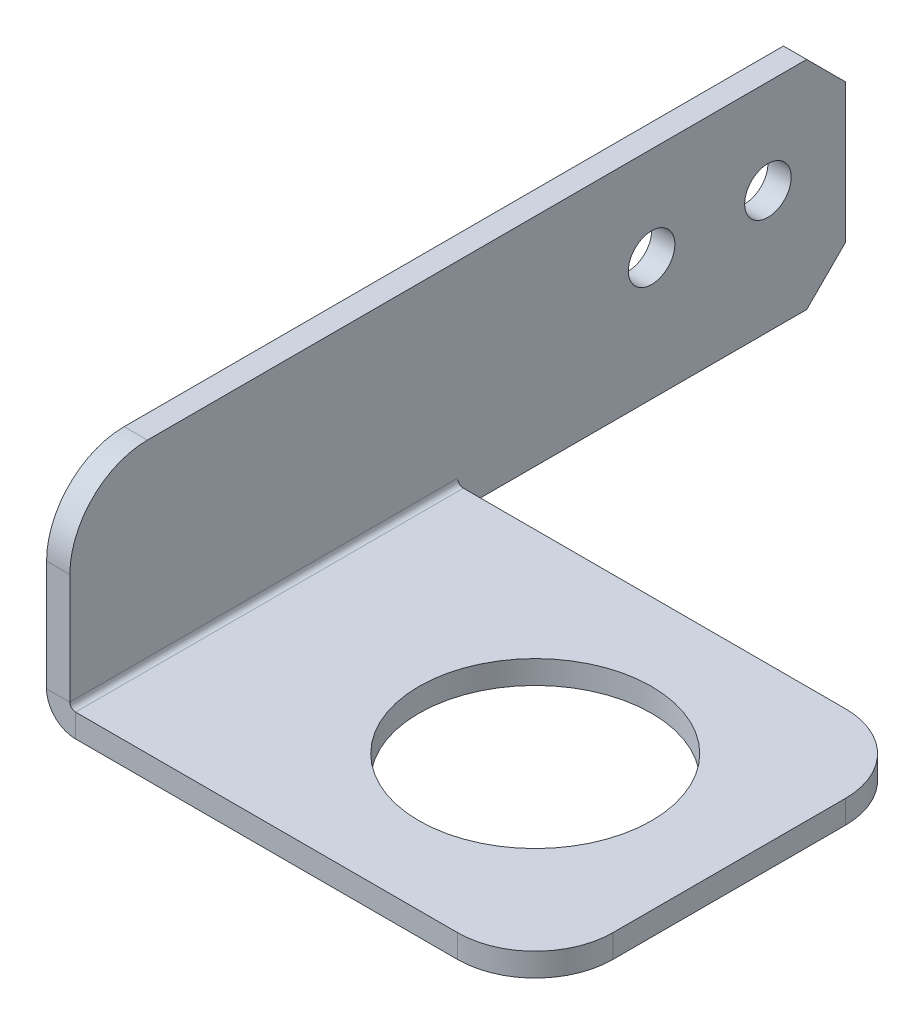
ISO-10303-21;
HEADER;
FILE_DESCRIPTION(('STEP AP214'),'2;1');
FILE_NAME('part.step','',(''),(''),'','','');
FILE_SCHEMA(('AUTOMOTIVE_DESIGN { 1 0 10303 214 1 1 1 1 }'));
ENDSEC;
DATA;
#1=APPLICATION_CONTEXT('core data for automotive mechanical design processes');
#2=APPLICATION_PROTOCOL_DEFINITION('international standard','automotive_design',2000,#1);
#3=PRODUCT_CONTEXT('',#1,'mechanical');
#4=PRODUCT('Part','Part','',(#3));
#5=PRODUCT_RELATED_PRODUCT_CATEGORY('part','',(#4));
#6=PRODUCT_DEFINITION_FORMATION('','',#4);
#7=PRODUCT_DEFINITION_CONTEXT('part definition',#1,'design');
#8=PRODUCT_DEFINITION('design','',#6,#7);
#9=PRODUCT_DEFINITION_SHAPE('','',#8);
#10=(LENGTH_UNIT() NAMED_UNIT(*) SI_UNIT(.MILLI.,.METRE.));
#11=(NAMED_UNIT(*) PLANE_ANGLE_UNIT() SI_UNIT($,.RADIAN.));
#12=(NAMED_UNIT(*) SI_UNIT($,.STERADIAN.) SOLID_ANGLE_UNIT());
#13=UNCERTAINTY_MEASURE_WITH_UNIT(LENGTH_MEASURE(1.E-05),#10,'distance_accuracy_value','');
#14=(GEOMETRIC_REPRESENTATION_CONTEXT(3) GLOBAL_UNCERTAINTY_ASSIGNED_CONTEXT((#13)) GLOBAL_UNIT_ASSIGNED_CONTEXT((#10,
#11,#12)) REPRESENTATION_CONTEXT('',''));
#15=CARTESIAN_POINT('',(0.,0.,0.));
#16=DIRECTION('',(0.,0.,1.));
#17=DIRECTION('',(1.,0.,0.));
#18=AXIS2_PLACEMENT_3D('',#15,#16,#17);
#19=CARTESIAN_POINT('',(0.7366,-3.,-100.));
#20=DIRECTION('',(0.,0.,-1.));
#21=DIRECTION('',(-1.,0.,0.));
#22=AXIS2_PLACEMENT_3D('',#19,#20,#21);
#23=PLANE('',#22);
#24=DIRECTION('',(1.,0.,0.));
#25=VECTOR('',#24,1.);
#26=CARTESIAN_POINT('',(-3.,2.07332277871303,-100.));
#27=LINE('',#26,#25);
#28=CARTESIAN_POINT('',(-3.,2.07332277871303,-100.));
#29=VERTEX_POINT('',#28);
#30=CARTESIAN_POINT('',(0.,2.07332277871303,-100.));
#31=VERTEX_POINT('',#30);
#32=EDGE_CURVE('E49',#29,#31,#27,.T.);
#33=ORIENTED_EDGE('',*,*,#32,.F.);
#34=DIRECTION('',(0.,-1.,0.));
#35=VECTOR('',#34,1.);
#36=CARTESIAN_POINT('',(-3.,25.,-100.));
#37=LINE('',#36,#35);
#38=CARTESIAN_POINT('',(-3.,20.,-100.));
#39=VERTEX_POINT('',#38);
#40=EDGE_CURVE('E145',#39,#29,#37,.T.);
#41=ORIENTED_EDGE('',*,*,#40,.F.);
#42=DIRECTION('',(1.,0.,0.));
#43=VECTOR('',#42,1.);
#44=CARTESIAN_POINT('',(-3.,20.,-100.));
#45=LINE('',#44,#43);
#46=CARTESIAN_POINT('',(0.,20.,-100.));
#47=VERTEX_POINT('',#46);
#48=EDGE_CURVE('E272',#39,#47,#45,.T.);
#49=ORIENTED_EDGE('',*,*,#48,.T.);
#50=DIRECTION('',(0.,-1.,0.));
#51=VECTOR('',#50,1.);
#52=CARTESIAN_POINT('',(0.,25.,-100.));
#53=LINE('',#52,#51);
#54=EDGE_CURVE('E147',#47,#31,#53,.T.);
#55=ORIENTED_EDGE('',*,*,#54,.T.);
#56=EDGE_LOOP('',(#33,#41,#49,#55));
#57=FACE_BOUND('',#56,.T.);
#58=ADVANCED_FACE('F34',(#57),#23,.T.);
#59=CARTESIAN_POINT('',(0.7366,0.,0.));
#60=DIRECTION('',(0.,0.,1.));
#61=DIRECTION('',(1.,0.,0.));
#62=AXIS2_PLACEMENT_3D('',#59,#60,#61);
#63=PLANE('',#62);
#64=DIRECTION('',(0.,-1.,0.));
#65=VECTOR('',#64,1.);
#66=CARTESIAN_POINT('',(0.7366,0.,0.));
#67=LINE('',#66,#65);
#68=CARTESIAN_POINT('',(0.7366,0.,0.));
#69=VERTEX_POINT('',#68);
#70=CARTESIAN_POINT('',(0.7366,-3.,0.));
#71=VERTEX_POINT('',#70);
#72=EDGE_CURVE('E198',#69,#71,#67,.T.);
#73=ORIENTED_EDGE('',*,*,#72,.F.);
#74=CARTESIAN_POINT('',(0.7366,0.7366,0.));
#75=DIRECTION('',(0.,0.,-1.));
#76=DIRECTION('',(-1.,0.,0.));
#77=AXIS2_PLACEMENT_3D('',#74,#75,#76);
#78=CIRCLE('',#77,0.7366);
#79=CARTESIAN_POINT('',(0.,0.7366,0.));
#80=VERTEX_POINT('',#79);
#81=EDGE_CURVE('E170',#80,#69,#78,.F.);
#82=ORIENTED_EDGE('',*,*,#81,.F.);
#83=DIRECTION('',(1.,0.,0.));
#84=VECTOR('',#83,1.);
#85=CARTESIAN_POINT('',(-3.,0.736600000000001,0.));
#86=LINE('',#85,#84);
#87=CARTESIAN_POINT('',(-3.,0.736600000000001,0.));
#88=VERTEX_POINT('',#87);
#89=EDGE_CURVE('E182',#88,#80,#86,.T.);
#90=ORIENTED_EDGE('',*,*,#89,.F.);
#91=CARTESIAN_POINT('',(0.7366,0.7366,0.));
#92=DIRECTION('',(0.,0.,1.));
#93=DIRECTION('',(1.,0.,0.));
#94=AXIS2_PLACEMENT_3D('',#91,#92,#93);
#95=CIRCLE('',#94,3.7366);
#96=EDGE_CURVE('E159',#88,#71,#95,.T.);
#97=ORIENTED_EDGE('',*,*,#96,.T.);
#98=EDGE_LOOP('',(#73,#82,#90,#97));
#99=FACE_BOUND('',#98,.T.);
#100=ADVANCED_FACE('F308',(#99),#63,.T.);
#101=CARTESIAN_POINT('',(-3.,0.736600000000001,0.));
#102=DIRECTION('',(0.,0.,1.));
#103=DIRECTION('',(1.,0.,0.));
#104=AXIS2_PLACEMENT_3D('',#101,#102,#103);
#105=PLANE('',#104);
#106=DIRECTION('',(1.,0.,0.));
#107=VECTOR('',#106,1.);
#108=CARTESIAN_POINT('',(0.,-3.,0.));
#109=LINE('',#108,#107);
#110=CARTESIAN_POINT('',(50.,-3.,0.));
#111=VERTEX_POINT('',#110);
#112=EDGE_CURVE('E163',#71,#111,#109,.T.);
#113=ORIENTED_EDGE('',*,*,#112,.T.);
#114=DIRECTION('',(0.,-1.,0.));
#115=VECTOR('',#114,1.);
#116=CARTESIAN_POINT('',(50.,0.,0.));
#117=LINE('',#116,#115);
#118=CARTESIAN_POINT('',(50.,0.,0.));
#119=VERTEX_POINT('',#118);
#120=EDGE_CURVE('E11',#111,#119,#117,.F.);
#121=ORIENTED_EDGE('',*,*,#120,.T.);
#122=DIRECTION('',(1.,0.,0.));
#123=VECTOR('',#122,1.);
#124=CARTESIAN_POINT('',(0.,0.,0.));
#125=LINE('',#124,#123);
#126=EDGE_CURVE('E166',#69,#119,#125,.T.);
#127=ORIENTED_EDGE('',*,*,#126,.F.);
#128=ORIENTED_EDGE('',*,*,#72,.T.);
#129=EDGE_LOOP('',(#113,#121,#127,#128));
#130=FACE_BOUND('',#129,.T.);
#131=ADVANCED_FACE('F313',(#130),#105,.T.);
#132=CARTESIAN_POINT('',(0.,-3.,-100.));
#133=DIRECTION('',(0.,-1.,0.));
#134=DIRECTION('',(0.,0.,-1.));
#135=AXIS2_PLACEMENT_3D('',#132,#133,#134);
#136=PLANE('',#135);
#137=CARTESIAN_POINT('',(35.,-3.,-25.));
#138=DIRECTION('',(0.,1.,0.));
#139=DIRECTION('',(0.,0.,1.));
#140=AXIS2_PLACEMENT_3D('',#137,#138,#139);
#141=CIRCLE('',#140,15.);
#142=CARTESIAN_POINT('',(35.,-3.,-10.));
#143=VERTEX_POINT('',#142);
#144=EDGE_CURVE('E288',#143,#143,#141,.T.);
#145=ORIENTED_EDGE('',*,*,#144,.T.);
#146=EDGE_LOOP('',(#145));
#147=FACE_BOUND('',#146,.T.);
#148=DIRECTION('',(1.,0.,0.));
#149=VECTOR('',#148,1.);
#150=CARTESIAN_POINT('',(0.,-3.,-50.));
#151=LINE('',#150,#149);
#152=CARTESIAN_POINT('',(0.7366,-3.,-50.));
#153=VERTEX_POINT('',#152);
#154=CARTESIAN_POINT('',(50.,-3.,-50.));
#155=VERTEX_POINT('',#154);
#156=EDGE_CURVE('E230',#153,#155,#151,.T.);
#157=ORIENTED_EDGE('',*,*,#156,.T.);
#158=CARTESIAN_POINT('',(50.,-3.,-40.));
#159=DIRECTION('',(0.,-1.,0.));
#160=DIRECTION('',(0.,0.,-1.));
#161=AXIS2_PLACEMENT_3D('',#158,#159,#160);
#162=CIRCLE('',#161,10.);
#163=CARTESIAN_POINT('',(60.,-3.,-40.));
#164=VERTEX_POINT('',#163);
#165=EDGE_CURVE('E42',#155,#164,#162,.T.);
#166=ORIENTED_EDGE('',*,*,#165,.T.);
#167=DIRECTION('',(0.,0.,1.));
#168=VECTOR('',#167,1.);
#169=CARTESIAN_POINT('',(60.,-3.,-100.));
#170=LINE('',#169,#168);
#171=CARTESIAN_POINT('',(60.,-3.,-9.99999999999999));
#172=VERTEX_POINT('',#171);
#173=EDGE_CURVE('E154',#164,#172,#170,.T.);
#174=ORIENTED_EDGE('',*,*,#173,.T.);
#175=CARTESIAN_POINT('',(50.,-3.,-9.99999999999999));
#176=DIRECTION('',(0.,-1.,0.));
#177=DIRECTION('',(0.,0.,-1.));
#178=AXIS2_PLACEMENT_3D('',#175,#176,#177);
#179=CIRCLE('',#178,10.);
#180=EDGE_CURVE('E223',#172,#111,#179,.T.);
#181=ORIENTED_EDGE('',*,*,#180,.T.);
#182=ORIENTED_EDGE('',*,*,#112,.F.);
#183=DIRECTION('',(0.,0.,1.));
#184=VECTOR('',#183,1.);
#185=CARTESIAN_POINT('',(0.7366,-3.,-100.));
#186=LINE('',#185,#184);
#187=EDGE_CURVE('E180',#153,#71,#186,.T.);
#188=ORIENTED_EDGE('',*,*,#187,.F.);
#189=EDGE_LOOP('',(#157,#166,#174,#181,#182,#188));
#190=FACE_BOUND('',#189,.T.);
#191=ADVANCED_FACE('F228',(#147,#190),#136,.T.);
#192=CARTESIAN_POINT('',(0.7366,0.7366,-100.));
#193=DIRECTION('',(0.,0.,1.));
#194=DIRECTION('',(1.,0.,0.));
#195=AXIS2_PLACEMENT_3D('',#192,#193,#194);
#196=CYLINDRICAL_SURFACE('',#195,3.7366);
#197=CARTESIAN_POINT('',(0.7366,0.7366,-98.663277221287));
#198=DIRECTION('',(0.,0.707106781186547,0.707106781186547));
#199=DIRECTION('',(0.,-0.707106781186548,0.707106781186548));
#200=AXIS2_PLACEMENT_3D('',#197,#198,#199);
#201=ELLIPSE('',#200,5.28435039716331,3.7366);
#202=CARTESIAN_POINT('',(0.,-2.92667722128697,-95.));
#203=VERTEX_POINT('',#202);
#204=CARTESIAN_POINT('',(-3.,0.736599999999998,-98.663277221287));
#205=VERTEX_POINT('',#204);
#206=EDGE_CURVE('E135',#203,#205,#201,.F.);
#207=ORIENTED_EDGE('',*,*,#206,.F.);
#208=DIRECTION('',(0.,0.,1.));
#209=VECTOR('',#208,1.);
#210=CARTESIAN_POINT('',(0.,-2.92667722128697,-100.));
#211=LINE('',#210,#209);
#212=CARTESIAN_POINT('',(0.,-2.92667722128697,-50.));
#213=VERTEX_POINT('',#212);
#214=EDGE_CURVE('E167',#213,#203,#211,.F.);
#215=ORIENTED_EDGE('',*,*,#214,.F.);
#216=CARTESIAN_POINT('',(0.7366,0.7366,-50.));
#217=DIRECTION('',(0.,0.,1.));
#218=DIRECTION('',(1.,0.,0.));
#219=AXIS2_PLACEMENT_3D('',#216,#217,#218);
#220=CIRCLE('',#219,3.7366);
#221=EDGE_CURVE('E251',#153,#213,#220,.F.);
#222=ORIENTED_EDGE('',*,*,#221,.F.);
#223=ORIENTED_EDGE('',*,*,#187,.T.);
#224=ORIENTED_EDGE('',*,*,#96,.F.);
#225=DIRECTION('',(0.,0.,1.));
#226=VECTOR('',#225,1.);
#227=CARTESIAN_POINT('',(-3.,0.736600000000001,-100.));
#228=LINE('',#227,#226);
#229=EDGE_CURVE('E183',#205,#88,#228,.T.);
#230=ORIENTED_EDGE('',*,*,#229,.F.);
#231=EDGE_LOOP('',(#207,#215,#222,#223,#224,#230));
#232=FACE_BOUND('',#231,.T.);
#233=ADVANCED_FACE('F264',(#232),#196,.T.);
#234=CARTESIAN_POINT('',(-3.,25.,-100.));
#235=DIRECTION('',(-1.,0.,0.));
#236=DIRECTION('',(0.,-1.,0.));
#237=AXIS2_PLACEMENT_3D('',#234,#235,#236);
#238=PLANE('',#237);
#239=DIRECTION('',(0.,-0.707106781186547,0.707106781186547));
#240=VECTOR('',#239,1.);
#241=CARTESIAN_POINT('',(-3.,-2.92667722128697,-95.));
#242=LINE('',#241,#240);
#243=EDGE_CURVE('E132',#29,#205,#242,.T.);
#244=ORIENTED_EDGE('',*,*,#243,.T.);
#245=ORIENTED_EDGE('',*,*,#229,.T.);
#246=DIRECTION('',(0.,-1.,0.));
#247=VECTOR('',#246,1.);
#248=CARTESIAN_POINT('',(-3.,25.,0.));
#249=LINE('',#248,#247);
#250=CARTESIAN_POINT('',(-3.,15.,0.));
#251=VERTEX_POINT('',#250);
#252=EDGE_CURVE('E175',#251,#88,#249,.T.);
#253=ORIENTED_EDGE('',*,*,#252,.F.);
#254=CARTESIAN_POINT('',(-3.,15.,-9.99999999999999));
#255=DIRECTION('',(-1.,0.,0.));
#256=DIRECTION('',(0.,-1.,0.));
#257=AXIS2_PLACEMENT_3D('',#254,#255,#256);
#258=CIRCLE('',#257,10.);
#259=CARTESIAN_POINT('',(-3.,25.,-9.99999999999999));
#260=VERTEX_POINT('',#259);
#261=EDGE_CURVE('E208',#251,#260,#258,.T.);
#262=ORIENTED_EDGE('',*,*,#261,.T.);
#263=DIRECTION('',(0.,0.,1.));
#264=VECTOR('',#263,1.);
#265=CARTESIAN_POINT('',(-3.,25.,-100.));
#266=LINE('',#265,#264);
#267=CARTESIAN_POINT('',(-3.,25.,-95.));
#268=VERTEX_POINT('',#267);
#269=EDGE_CURVE('E185',#268,#260,#266,.T.);
#270=ORIENTED_EDGE('',*,*,#269,.F.);
#271=DIRECTION('',(0.,-0.707106781186547,-0.707106781186547));
#272=VECTOR('',#271,1.);
#273=CARTESIAN_POINT('',(-3.,25.,-95.));
#274=LINE('',#273,#272);
#275=EDGE_CURVE('E153',#268,#39,#274,.T.);
#276=ORIENTED_EDGE('',*,*,#275,.T.);
#277=ORIENTED_EDGE('',*,*,#40,.T.);
#278=EDGE_LOOP('',(#244,#245,#253,#262,#270,#276,#277));
#279=FACE_BOUND('',#278,.T.);
#280=CARTESIAN_POINT('',(-3.,12.8683,-90.));
#281=DIRECTION('',(1.,0.,0.));
#282=DIRECTION('',(0.,1.,0.));
#283=AXIS2_PLACEMENT_3D('',#280,#281,#282);
#284=CIRCLE('',#283,3.00000000000001);
#285=CARTESIAN_POINT('',(-3.,15.8683,-90.));
#286=VERTEX_POINT('',#285);
#287=EDGE_CURVE('E276',#286,#286,#284,.T.);
#288=ORIENTED_EDGE('',*,*,#287,.T.);
#289=EDGE_LOOP('',(#288));
#290=FACE_BOUND('',#289,.T.);
#291=CARTESIAN_POINT('',(-3.,12.8683,-75.));
#292=DIRECTION('',(1.,0.,0.));
#293=DIRECTION('',(0.,1.,0.));
#294=AXIS2_PLACEMENT_3D('',#291,#292,#293);
#295=CIRCLE('',#294,3.00000000000001);
#296=CARTESIAN_POINT('',(-3.,15.8683,-75.));
#297=VERTEX_POINT('',#296);
#298=EDGE_CURVE('E282',#297,#297,#295,.T.);
#299=ORIENTED_EDGE('',*,*,#298,.T.);
#300=EDGE_LOOP('',(#299));
#301=FACE_BOUND('',#300,.T.);
#302=ADVANCED_FACE('F150',(#279,#290,#301),#238,.T.);
#303=CARTESIAN_POINT('',(-3.,25.,-100.));
#304=DIRECTION('',(0.,-1.,0.));
#305=DIRECTION('',(0.,0.,-1.));
#306=AXIS2_PLACEMENT_3D('',#303,#304,#305);
#307=PLANE('',#306);
#308=DIRECTION('',(0.,0.,1.));
#309=VECTOR('',#308,1.);
#310=CARTESIAN_POINT('',(0.,25.,-100.));
#311=LINE('',#310,#309);
#312=CARTESIAN_POINT('',(0.,25.,-95.));
#313=VERTEX_POINT('',#312);
#314=CARTESIAN_POINT('',(0.,25.,-9.99999999999999));
#315=VERTEX_POINT('',#314);
#316=EDGE_CURVE('E187',#313,#315,#311,.T.);
#317=ORIENTED_EDGE('',*,*,#316,.F.);
#318=DIRECTION('',(1.,0.,0.));
#319=VECTOR('',#318,1.);
#320=CARTESIAN_POINT('',(-3.,25.,-95.));
#321=LINE('',#320,#319);
#322=EDGE_CURVE('E57',#268,#313,#321,.T.);
#323=ORIENTED_EDGE('',*,*,#322,.F.);
#324=ORIENTED_EDGE('',*,*,#269,.T.);
#325=DIRECTION('',(1.,0.,0.));
#326=VECTOR('',#325,1.);
#327=CARTESIAN_POINT('',(-3.,25.,-9.99999999999999));
#328=LINE('',#327,#326);
#329=EDGE_CURVE('E201',#260,#315,#328,.T.);
#330=ORIENTED_EDGE('',*,*,#329,.T.);
#331=EDGE_LOOP('',(#317,#323,#324,#330));
#332=FACE_BOUND('',#331,.T.);
#333=ADVANCED_FACE('F349',(#332),#307,.F.);
#334=CARTESIAN_POINT('',(0.,25.,-100.));
#335=DIRECTION('',(-1.,0.,0.));
#336=DIRECTION('',(0.,-1.,0.));
#337=AXIS2_PLACEMENT_3D('',#334,#335,#336);
#338=PLANE('',#337);
#339=CARTESIAN_POINT('',(0.,12.8683,-90.));
#340=DIRECTION('',(1.,0.,0.));
#341=DIRECTION('',(0.,1.,0.));
#342=AXIS2_PLACEMENT_3D('',#339,#340,#341);
#343=CIRCLE('',#342,3.00000000000001);
#344=CARTESIAN_POINT('',(0.,15.8683,-90.));
#345=VERTEX_POINT('',#344);
#346=EDGE_CURVE('E274',#345,#345,#343,.T.);
#347=ORIENTED_EDGE('',*,*,#346,.F.);
#348=EDGE_LOOP('',(#347));
#349=FACE_BOUND('',#348,.T.);
#350=CARTESIAN_POINT('',(0.,12.8683,-75.));
#351=DIRECTION('',(1.,0.,0.));
#352=DIRECTION('',(0.,1.,0.));
#353=AXIS2_PLACEMENT_3D('',#350,#351,#352);
#354=CIRCLE('',#353,3.00000000000001);
#355=CARTESIAN_POINT('',(0.,15.8683,-75.));
#356=VERTEX_POINT('',#355);
#357=EDGE_CURVE('E279',#356,#356,#354,.T.);
#358=ORIENTED_EDGE('',*,*,#357,.F.);
#359=EDGE_LOOP('',(#358));
#360=FACE_BOUND('',#359,.T.);
#361=ORIENTED_EDGE('',*,*,#214,.T.);
#362=DIRECTION('',(0.,-0.707106781186547,0.707106781186547));
#363=VECTOR('',#362,1.);
#364=CARTESIAN_POINT('',(0.,-2.92667722128697,-95.));
#365=LINE('',#364,#363);
#366=EDGE_CURVE('E139',#31,#203,#365,.T.);
#367=ORIENTED_EDGE('',*,*,#366,.F.);
#368=ORIENTED_EDGE('',*,*,#54,.F.);
#369=DIRECTION('',(0.,-0.707106781186547,-0.707106781186547));
#370=VECTOR('',#369,1.);
#371=CARTESIAN_POINT('',(0.,25.,-95.));
#372=LINE('',#371,#370);
#373=EDGE_CURVE('E266',#313,#47,#372,.T.);
#374=ORIENTED_EDGE('',*,*,#373,.F.);
#375=ORIENTED_EDGE('',*,*,#316,.T.);
#376=CARTESIAN_POINT('',(0.,15.,-9.99999999999999));
#377=DIRECTION('',(-1.,0.,0.));
#378=DIRECTION('',(0.,-1.,0.));
#379=AXIS2_PLACEMENT_3D('',#376,#377,#378);
#380=CIRCLE('',#379,10.);
#381=CARTESIAN_POINT('',(0.,15.,0.));
#382=VERTEX_POINT('',#381);
#383=EDGE_CURVE('E204',#315,#382,#380,.F.);
#384=ORIENTED_EDGE('',*,*,#383,.T.);
#385=DIRECTION('',(0.,-1.,0.));
#386=VECTOR('',#385,1.);
#387=CARTESIAN_POINT('',(0.,25.,0.));
#388=LINE('',#387,#386);
#389=EDGE_CURVE('E173',#382,#80,#388,.T.);
#390=ORIENTED_EDGE('',*,*,#389,.T.);
#391=DIRECTION('',(0.,0.,1.));
#392=VECTOR('',#391,1.);
#393=CARTESIAN_POINT('',(0.,0.7366,-100.));
#394=LINE('',#393,#392);
#395=CARTESIAN_POINT('',(0.,0.7366,-50.));
#396=VERTEX_POINT('',#395);
#397=EDGE_CURVE('E189',#396,#80,#394,.T.);
#398=ORIENTED_EDGE('',*,*,#397,.F.);
#399=DIRECTION('',(0.,1.,0.));
#400=VECTOR('',#399,1.);
#401=CARTESIAN_POINT('',(0.,-3.,-50.));
#402=LINE('',#401,#400);
#403=EDGE_CURVE('E249',#213,#396,#402,.T.);
#404=ORIENTED_EDGE('',*,*,#403,.F.);
#405=EDGE_LOOP('',(#361,#367,#368,#374,#375,#384,#390,#398,#404));
#406=FACE_BOUND('',#405,.T.);
#407=ADVANCED_FACE('F260',(#349,#360,#406),#338,.F.);
#408=CARTESIAN_POINT('',(0.7366,0.7366,-100.));
#409=DIRECTION('',(0.,0.,1.));
#410=DIRECTION('',(1.,0.,0.));
#411=AXIS2_PLACEMENT_3D('',#408,#409,#410);
#412=CYLINDRICAL_SURFACE('',#411,0.7366);
#413=DIRECTION('',(0.,0.,1.));
#414=VECTOR('',#413,1.);
#415=CARTESIAN_POINT('',(0.7366,0.,-100.));
#416=LINE('',#415,#414);
#417=CARTESIAN_POINT('',(0.7366,0.,-50.));
#418=VERTEX_POINT('',#417);
#419=EDGE_CURVE('E192',#418,#69,#416,.T.);
#420=ORIENTED_EDGE('',*,*,#419,.F.);
#421=CARTESIAN_POINT('',(0.7366,0.7366,-50.));
#422=DIRECTION('',(0.,0.,1.));
#423=DIRECTION('',(1.,0.,0.));
#424=AXIS2_PLACEMENT_3D('',#421,#422,#423);
#425=CIRCLE('',#424,0.7366);
#426=EDGE_CURVE('E247',#418,#396,#425,.F.);
#427=ORIENTED_EDGE('',*,*,#426,.T.);
#428=ORIENTED_EDGE('',*,*,#397,.T.);
#429=ORIENTED_EDGE('',*,*,#81,.T.);
#430=EDGE_LOOP('',(#420,#427,#428,#429));
#431=FACE_BOUND('',#430,.T.);
#432=ADVANCED_FACE('F297',(#431),#412,.F.);
#433=CARTESIAN_POINT('',(0.,0.,-100.));
#434=DIRECTION('',(0.,-1.,0.));
#435=DIRECTION('',(0.,0.,-1.));
#436=AXIS2_PLACEMENT_3D('',#433,#434,#435);
#437=PLANE('',#436);
#438=CARTESIAN_POINT('',(35.,0.,-25.));
#439=DIRECTION('',(0.,1.,0.));
#440=DIRECTION('',(0.,0.,1.));
#441=AXIS2_PLACEMENT_3D('',#438,#439,#440);
#442=CIRCLE('',#441,15.);
#443=CARTESIAN_POINT('',(35.,0.,-10.));
#444=VERTEX_POINT('',#443);
#445=EDGE_CURVE('E285',#444,#444,#442,.T.);
#446=ORIENTED_EDGE('',*,*,#445,.F.);
#447=EDGE_LOOP('',(#446));
#448=FACE_BOUND('',#447,.T.);
#449=DIRECTION('',(0.,0.,1.));
#450=VECTOR('',#449,1.);
#451=CARTESIAN_POINT('',(60.,0.,-100.));
#452=LINE('',#451,#450);
#453=CARTESIAN_POINT('',(60.,0.,-40.));
#454=VERTEX_POINT('',#453);
#455=CARTESIAN_POINT('',(60.,0.,-9.99999999999999));
#456=VERTEX_POINT('',#455);
#457=EDGE_CURVE('E157',#454,#456,#452,.T.);
#458=ORIENTED_EDGE('',*,*,#457,.F.);
#459=CARTESIAN_POINT('',(50.,0.,-40.));
#460=DIRECTION('',(0.,-1.,0.));
#461=DIRECTION('',(0.,0.,-1.));
#462=AXIS2_PLACEMENT_3D('',#459,#460,#461);
#463=CIRCLE('',#462,10.);
#464=CARTESIAN_POINT('',(50.,0.,-50.));
#465=VERTEX_POINT('',#464);
#466=EDGE_CURVE('E219',#454,#465,#463,.F.);
#467=ORIENTED_EDGE('',*,*,#466,.T.);
#468=DIRECTION('',(-1.,0.,0.));
#469=VECTOR('',#468,1.);
#470=CARTESIAN_POINT('',(0.,0.,-50.));
#471=LINE('',#470,#469);
#472=EDGE_CURVE('E242',#465,#418,#471,.T.);
#473=ORIENTED_EDGE('',*,*,#472,.T.);
#474=ORIENTED_EDGE('',*,*,#419,.T.);
#475=ORIENTED_EDGE('',*,*,#126,.T.);
#476=CARTESIAN_POINT('',(50.,0.,-9.99999999999999));
#477=DIRECTION('',(0.,-1.,0.));
#478=DIRECTION('',(0.,0.,-1.));
#479=AXIS2_PLACEMENT_3D('',#476,#477,#478);
#480=CIRCLE('',#479,10.);
#481=EDGE_CURVE('E217',#119,#456,#480,.F.);
#482=ORIENTED_EDGE('',*,*,#481,.T.);
#483=EDGE_LOOP('',(#458,#467,#473,#474,#475,#482));
#484=FACE_BOUND('',#483,.T.);
#485=ADVANCED_FACE('F241',(#448,#484),#437,.F.);
#486=CARTESIAN_POINT('',(60.,0.,-100.));
#487=DIRECTION('',(-1.,0.,0.));
#488=DIRECTION('',(0.,0.,1.));
#489=AXIS2_PLACEMENT_3D('',#486,#487,#488);
#490=PLANE('',#489);
#491=ORIENTED_EDGE('',*,*,#173,.F.);
#492=DIRECTION('',(0.,1.,0.));
#493=VECTOR('',#492,1.);
#494=CARTESIAN_POINT('',(60.,0.,-40.));
#495=LINE('',#494,#493);
#496=EDGE_CURVE('E214',#164,#454,#495,.T.);
#497=ORIENTED_EDGE('',*,*,#496,.T.);
#498=ORIENTED_EDGE('',*,*,#457,.T.);
#499=DIRECTION('',(0.,-1.,0.));
#500=VECTOR('',#499,1.);
#501=CARTESIAN_POINT('',(60.,-3.,-9.99999999999999));
#502=LINE('',#501,#500);
#503=EDGE_CURVE('E211',#456,#172,#502,.T.);
#504=ORIENTED_EDGE('',*,*,#503,.T.);
#505=EDGE_LOOP('',(#491,#497,#498,#504));
#506=FACE_BOUND('',#505,.T.);
#507=ADVANCED_FACE('F235',(#506),#490,.F.);
#508=CARTESIAN_POINT('',(0.7366,0.7366,0.));
#509=DIRECTION('',(0.,0.,-1.));
#510=DIRECTION('',(-1.,0.,0.));
#511=AXIS2_PLACEMENT_3D('',#508,#509,#510);
#512=PLANE('',#511);
#513=ORIENTED_EDGE('',*,*,#389,.F.);
#514=DIRECTION('',(1.,0.,0.));
#515=VECTOR('',#514,1.);
#516=CARTESIAN_POINT('',(0.7366,15.,0.));
#517=LINE('',#516,#515);
#518=EDGE_CURVE('E206',#382,#251,#517,.F.);
#519=ORIENTED_EDGE('',*,*,#518,.T.);
#520=ORIENTED_EDGE('',*,*,#252,.T.);
#521=ORIENTED_EDGE('',*,*,#89,.T.);
#522=EDGE_LOOP('',(#513,#519,#520,#521));
#523=FACE_BOUND('',#522,.T.);
#524=ADVANCED_FACE('F303',(#523),#512,.F.);
#525=CARTESIAN_POINT('',(0.,-3.,-50.));
#526=DIRECTION('',(0.,0.,1.));
#527=DIRECTION('',(1.,0.,0.));
#528=AXIS2_PLACEMENT_3D('',#525,#526,#527);
#529=PLANE('',#528);
#530=ORIENTED_EDGE('',*,*,#472,.F.);
#531=DIRECTION('',(0.,1.,0.));
#532=VECTOR('',#531,1.);
#533=CARTESIAN_POINT('',(50.,-3.,-50.));
#534=LINE('',#533,#532);
#535=EDGE_CURVE('E221',#465,#155,#534,.F.);
#536=ORIENTED_EDGE('',*,*,#535,.T.);
#537=ORIENTED_EDGE('',*,*,#156,.F.);
#538=ORIENTED_EDGE('',*,*,#221,.T.);
#539=ORIENTED_EDGE('',*,*,#403,.T.);
#540=ORIENTED_EDGE('',*,*,#426,.F.);
#541=EDGE_LOOP('',(#530,#536,#537,#538,#539,#540));
#542=FACE_BOUND('',#541,.T.);
#543=ADVANCED_FACE('F245',(#542),#529,.F.);
#544=CARTESIAN_POINT('',(35.,-3.,-25.));
#545=DIRECTION('',(0.,1.,0.));
#546=DIRECTION('',(0.,0.,1.));
#547=AXIS2_PLACEMENT_3D('',#544,#545,#546);
#548=CYLINDRICAL_SURFACE('',#547,15.);
#549=ORIENTED_EDGE('',*,*,#144,.F.);
#550=EDGE_LOOP('',(#549));
#551=FACE_BOUND('',#550,.T.);
#552=ORIENTED_EDGE('',*,*,#445,.T.);
#553=EDGE_LOOP('',(#552));
#554=FACE_BOUND('',#553,.T.);
#555=ADVANCED_FACE('F294',(#551,#554),#548,.F.);
#556=CARTESIAN_POINT('',(-3.,12.8683,-75.));
#557=DIRECTION('',(1.,0.,0.));
#558=DIRECTION('',(0.,1.,0.));
#559=AXIS2_PLACEMENT_3D('',#556,#557,#558);
#560=CYLINDRICAL_SURFACE('',#559,3.00000000000001);
#561=ORIENTED_EDGE('',*,*,#298,.F.);
#562=EDGE_LOOP('',(#561));
#563=FACE_BOUND('',#562,.T.);
#564=ORIENTED_EDGE('',*,*,#357,.T.);
#565=EDGE_LOOP('',(#564));
#566=FACE_BOUND('',#565,.T.);
#567=ADVANCED_FACE('F368',(#563,#566),#560,.F.);
#568=CARTESIAN_POINT('',(-3.,12.8683,-90.));
#569=DIRECTION('',(1.,0.,0.));
#570=DIRECTION('',(0.,1.,0.));
#571=AXIS2_PLACEMENT_3D('',#568,#569,#570);
#572=CYLINDRICAL_SURFACE('',#571,3.00000000000001);
#573=ORIENTED_EDGE('',*,*,#287,.F.);
#574=EDGE_LOOP('',(#573));
#575=FACE_BOUND('',#574,.T.);
#576=ORIENTED_EDGE('',*,*,#346,.T.);
#577=EDGE_LOOP('',(#576));
#578=FACE_BOUND('',#577,.T.);
#579=ADVANCED_FACE('F320',(#575,#578),#572,.F.);
#580=CARTESIAN_POINT('',(-3.,15.,-9.99999999999999));
#581=DIRECTION('',(1.,0.,0.));
#582=DIRECTION('',(0.,0.,-1.));
#583=AXIS2_PLACEMENT_3D('',#580,#581,#582);
#584=CYLINDRICAL_SURFACE('',#583,10.);
#585=ORIENTED_EDGE('',*,*,#261,.F.);
#586=ORIENTED_EDGE('',*,*,#518,.F.);
#587=ORIENTED_EDGE('',*,*,#383,.F.);
#588=ORIENTED_EDGE('',*,*,#329,.F.);
#589=EDGE_LOOP('',(#585,#586,#587,#588));
#590=FACE_BOUND('',#589,.T.);
#591=ADVANCED_FACE('F318',(#590),#584,.T.);
#592=CARTESIAN_POINT('',(50.,0.,-40.));
#593=DIRECTION('',(0.,1.,0.));
#594=DIRECTION('',(0.,0.,1.));
#595=AXIS2_PLACEMENT_3D('',#592,#593,#594);
#596=CYLINDRICAL_SURFACE('',#595,10.);
#597=ORIENTED_EDGE('',*,*,#165,.F.);
#598=ORIENTED_EDGE('',*,*,#535,.F.);
#599=ORIENTED_EDGE('',*,*,#466,.F.);
#600=ORIENTED_EDGE('',*,*,#496,.F.);
#601=EDGE_LOOP('',(#597,#598,#599,#600));
#602=FACE_BOUND('',#601,.T.);
#603=ADVANCED_FACE('F238',(#602),#596,.T.);
#604=CARTESIAN_POINT('',(50.,0.,-9.99999999999999));
#605=DIRECTION('',(0.,1.,0.));
#606=DIRECTION('',(0.,0.,1.));
#607=AXIS2_PLACEMENT_3D('',#604,#605,#606);
#608=CYLINDRICAL_SURFACE('',#607,10.);
#609=ORIENTED_EDGE('',*,*,#481,.F.);
#610=ORIENTED_EDGE('',*,*,#120,.F.);
#611=ORIENTED_EDGE('',*,*,#180,.F.);
#612=ORIENTED_EDGE('',*,*,#503,.F.);
#613=EDGE_LOOP('',(#609,#610,#611,#612));
#614=FACE_BOUND('',#613,.T.);
#615=ADVANCED_FACE('F36',(#614),#608,.T.);
#616=CARTESIAN_POINT('',(-3.,25.,-95.));
#617=DIRECTION('',(0.,-0.707106781186547,0.707106781186547));
#618=DIRECTION('',(0.,-0.707106781186548,-0.707106781186548));
#619=AXIS2_PLACEMENT_3D('',#616,#617,#618);
#620=PLANE('',#619);
#621=ORIENTED_EDGE('',*,*,#373,.T.);
#622=ORIENTED_EDGE('',*,*,#48,.F.);
#623=ORIENTED_EDGE('',*,*,#275,.F.);
#624=ORIENTED_EDGE('',*,*,#322,.T.);
#625=EDGE_LOOP('',(#621,#622,#623,#624));
#626=FACE_BOUND('',#625,.T.);
#627=ADVANCED_FACE('F326',(#626),#620,.F.);
#628=CARTESIAN_POINT('',(-3.,-2.92667722128697,-95.));
#629=DIRECTION('',(0.,0.707106781186547,0.707106781186547));
#630=DIRECTION('',(0.,-0.707106781186548,0.707106781186548));
#631=AXIS2_PLACEMENT_3D('',#628,#629,#630);
#632=PLANE('',#631);
#633=ORIENTED_EDGE('',*,*,#206,.T.);
#634=ORIENTED_EDGE('',*,*,#243,.F.);
#635=ORIENTED_EDGE('',*,*,#32,.T.);
#636=ORIENTED_EDGE('',*,*,#366,.T.);
#637=EDGE_LOOP('',(#633,#634,#635,#636));
#638=FACE_BOUND('',#637,.T.);
#639=ADVANCED_FACE('F133',(#638),#632,.F.);
#640=CLOSED_SHELL('',(#58,#100,#131,#191,#233,#302,#333,#407,#432,#485,#507,#524,#543,#555,#567,
#579,#591,#603,#615,#627,#639));
#641=MANIFOLD_SOLID_BREP('B2',#640);
#642=ADVANCED_BREP_SHAPE_REPRESENTATION('',(#18,#641),#14);
#643=SHAPE_DEFINITION_REPRESENTATION(#9,#642);
ENDSEC;
END-ISO-10303-21;
